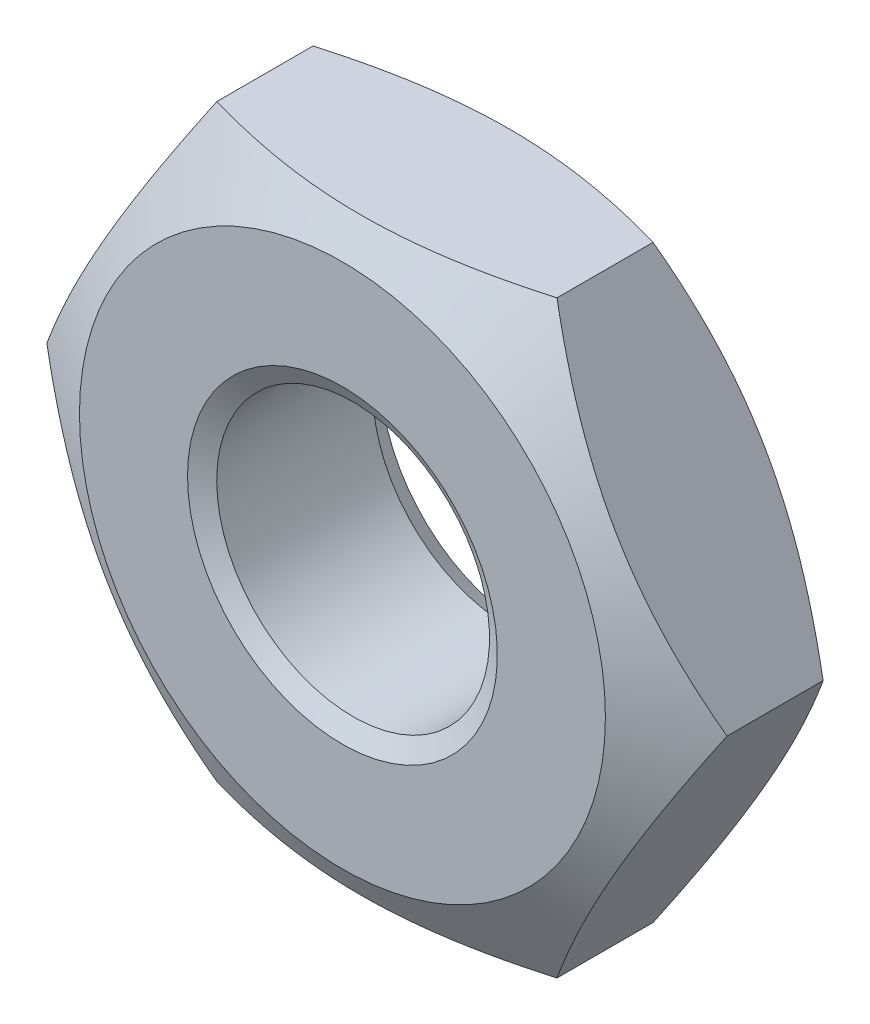
ISO-10303-21;
HEADER;
FILE_DESCRIPTION(('STEP AP214'),'2;1');
FILE_NAME('part.step','',(''),(''),'','','');
FILE_SCHEMA(('AUTOMOTIVE_DESIGN { 1 0 10303 214 1 1 1 1 }'));
ENDSEC;
DATA;
#1=APPLICATION_CONTEXT('core data for automotive mechanical design processes');
#2=APPLICATION_PROTOCOL_DEFINITION('international standard','automotive_design',2000,#1);
#3=PRODUCT_CONTEXT('',#1,'mechanical');
#4=PRODUCT('Part','Part','',(#3));
#5=PRODUCT_RELATED_PRODUCT_CATEGORY('part','',(#4));
#6=PRODUCT_DEFINITION_FORMATION('','',#4);
#7=PRODUCT_DEFINITION_CONTEXT('part definition',#1,'design');
#8=PRODUCT_DEFINITION('design','',#6,#7);
#9=PRODUCT_DEFINITION_SHAPE('','',#8);
#10=(LENGTH_UNIT() NAMED_UNIT(*) SI_UNIT(.MILLI.,.METRE.));
#11=(NAMED_UNIT(*) PLANE_ANGLE_UNIT() SI_UNIT($,.RADIAN.));
#12=(NAMED_UNIT(*) SI_UNIT($,.STERADIAN.) SOLID_ANGLE_UNIT());
#13=UNCERTAINTY_MEASURE_WITH_UNIT(LENGTH_MEASURE(1.E-05),#10,'distance_accuracy_value','');
#14=(GEOMETRIC_REPRESENTATION_CONTEXT(3) GLOBAL_UNCERTAINTY_ASSIGNED_CONTEXT((#13)) GLOBAL_UNIT_ASSIGNED_CONTEXT((#10,
#11,#12)) REPRESENTATION_CONTEXT('',''));
#15=CARTESIAN_POINT('',(0.,0.,0.));
#16=DIRECTION('',(0.,0.,1.));
#17=DIRECTION('',(1.,0.,0.));
#18=AXIS2_PLACEMENT_3D('',#15,#16,#17);
#19=CARTESIAN_POINT('',(-2.02072594216369,-3.5,-2.2));
#20=DIRECTION('',(0.,-1.,0.));
#21=DIRECTION('',(1.,0.,0.));
#22=AXIS2_PLACEMENT_3D('',#19,#20,#21);
#23=PLANE('',#22);
#24=CARTESIAN_POINT('',(-5.32929161655628,-3.5,-1.8768739570955));
#25=CARTESIAN_POINT('',(-5.17721390420334,-3.5,-1.80350487566599));
#26=CARTESIAN_POINT('',(-5.02477626879487,-3.5,-1.73086848507037));
#27=CARTESIAN_POINT('',(-4.71898932742077,-3.5,-1.58747532668502));
#28=CARTESIAN_POINT('',(-4.56563987276602,-3.5,-1.51671887634777));
#29=CARTESIAN_POINT('',(-4.25699896894404,-3.5,-1.37712246688913));
#30=CARTESIAN_POINT('',(-4.10170141818151,-3.5,-1.30829594938202));
#31=CARTESIAN_POINT('',(-3.78983593685733,-3.5,-1.17359495846471));
#32=CARTESIAN_POINT('',(-3.63326806987865,-3.5,-1.10772033836705));
#33=CARTESIAN_POINT('',(-3.31397317951131,-3.5,-0.97781828443784));
#34=CARTESIAN_POINT('',(-3.1512005381073,-3.5,-0.913902341262367));
#35=CARTESIAN_POINT('',(-2.82371486392436,-3.5,-0.791151177582949));
#36=CARTESIAN_POINT('',(-2.65900161073986,-3.5,-0.73231654063633));
#37=CARTESIAN_POINT('',(-2.32771428220931,-3.5,-0.621345152713909));
#38=CARTESIAN_POINT('',(-2.16114510129307,-3.5,-0.569193942659972));
#39=CARTESIAN_POINT('',(-1.82562056549125,-3.5,-0.473327366021485));
#40=CARTESIAN_POINT('',(-1.65666601191669,-3.5,-0.429609235647394));
#41=CARTESIAN_POINT('',(-1.31718369019254,-3.5,-0.352994778610296));
#42=CARTESIAN_POINT('',(-1.14666839877724,-3.5,-0.320044212866426));
#43=CARTESIAN_POINT('',(-0.80362519311759,-3.5,-0.266896804968947));
#44=CARTESIAN_POINT('',(-0.631097439623656,-3.5,-0.246698951170157));
#45=CARTESIAN_POINT('',(-0.287101025715155,-3.5,-0.220933629161962));
#46=CARTESIAN_POINT('',(-0.11564620335658,-3.5,-0.215185920399811));
#47=CARTESIAN_POINT('',(0.22713962522439,-3.5,-0.218339385870684));
#48=CARTESIAN_POINT('',(0.398470626774733,-3.5,-0.227241086660207));
#49=CARTESIAN_POINT('',(0.692349454676599,-3.5,-0.254460230237843));
#50=CARTESIAN_POINT('',(0.815219779631847,-3.5,-0.269472731532173));
#51=CARTESIAN_POINT('',(1.05998960024822,-3.5,-0.306041966481692));
#52=CARTESIAN_POINT('',(1.181888948341,-3.5,-0.327599676107724));
#53=CARTESIAN_POINT('',(1.54600794184171,-3.5,-0.400949728850131));
#54=CARTESIAN_POINT('',(1.7864984294178,-3.5,-0.461403324212361));
#55=CARTESIAN_POINT('',(2.14599672794727,-3.5,-0.565325828459473));
#56=CARTESIAN_POINT('',(2.26688905462246,-3.5,-0.602639268073536));
#57=CARTESIAN_POINT('',(2.50749825221244,-3.5,-0.680914127692014));
#58=CARTESIAN_POINT('',(2.62721511557209,-3.5,-0.72187557112648));
#59=CARTESIAN_POINT('',(2.86551603326949,-3.5,-0.806808159348505));
#60=CARTESIAN_POINT('',(2.98410049565285,-3.5,-0.850778169512184));
#61=CARTESIAN_POINT('',(3.22030222158572,-3.5,-0.941233650124732));
#62=CARTESIAN_POINT('',(3.33791949412912,-3.5,-0.987719097152016));
#63=CARTESIAN_POINT('',(3.60516917077565,-3.5,-1.09611499692003));
#64=CARTESIAN_POINT('',(3.75452937338733,-3.5,-1.15869521360889));
#65=CARTESIAN_POINT('',(4.05207329900666,-3.5,-1.28659848231524));
#66=CARTESIAN_POINT('',(4.20025696631961,-3.5,-1.3519216632692));
#67=CARTESIAN_POINT('',(4.64337511468221,-3.5,-1.55119395906001));
#68=CARTESIAN_POINT('',(4.93683132148516,-3.5,-1.68842699826923));
#69=CARTESIAN_POINT('',(5.52118834964412,-3.5,-1.96881056529861));
#70=CARTESIAN_POINT('',(5.81208673093573,-3.5,-2.11196612775869));
#71=CARTESIAN_POINT('',(6.39186182500917,-3.5,-2.40232740635005));
#72=CARTESIAN_POINT('',(6.6807384726872,-3.5,-2.54953325216251));
#73=CARTESIAN_POINT('',(7.23458971233423,-3.5,-2.83528891127491));
#74=CARTESIAN_POINT('',(7.49967651841012,-3.5,-2.97362193480413));
#75=CARTESIAN_POINT('',(8.02887233479629,-3.5,-3.25216194114885));
#76=CARTESIAN_POINT('',(8.29298131706612,-3.5,-3.39236897718081));
#77=CARTESIAN_POINT('',(8.81986478761872,-3.5,-3.67392059383066));
#78=CARTESIAN_POINT('',(9.082640922202,-3.5,-3.81526209803769));
#79=CARTESIAN_POINT('',(9.60756200305391,-3.5,-4.09908318288939));
#80=CARTESIAN_POINT('',(9.86970697870069,-3.5,-4.24156270917629));
#81=CARTESIAN_POINT('',(10.1316166656573,-3.5,-4.38447053028153));
#82=B_SPLINE_CURVE_WITH_KNOTS('',3,(#24,#25,#26,#27,#28,#29,#30,#31,#32,#33,#34,#35,#36,#37,#38,
#39,#40,#41,#42,#43,#44,#45,#46,#47,#48,#49,#50,#51,#52,#53,#54,#55,#56,#57,#58,#59,#60,#61,#62,
#63,#64,#65,#66,#67,#68,#69,#70,#71,#72,#73,#74,#75,#76,#77,#78,#79,#80,#81),.UNSPECIFIED.,.F.,
.F.,(4,2,2,2,2,2,2,2,2,2,2,2,2,2,2,2,2,2,2,2,2,2,2,2,2,2,2,2,4),(0.,0.506559628514696,
1.0132042594806,1.52277737705624,2.03232514447318,2.55687533860672,3.08148569427768,
3.60494121555669,4.12822489118331,4.64883048979078,5.16939478468658,5.68343298490769,
6.19748966205548,6.56865983363451,6.93988537844331,7.6827872097227,8.06231738596215,
8.44184999998748,8.82124026111236,9.20062699028891,9.68641258911835,10.1722210485271,
11.1439854050423,12.1165935361164,13.0892328442916,13.986254382644,14.8833014481238,
15.7784288466623,16.6735137420071),.UNSPECIFIED.);
#83=CARTESIAN_POINT('',(-2.02072594216369,-3.5,-0.529113742115746));
#84=VERTEX_POINT('',#83);
#85=CARTESIAN_POINT('',(2.02072594216369,-3.5,-0.529113742115746));
#86=VERTEX_POINT('',#85);
#87=EDGE_CURVE('E50',#84,#86,#82,.T.);
#88=ORIENTED_EDGE('',*,*,#87,.F.);
#89=DIRECTION('',(0.,0.,1.));
#90=VECTOR('',#89,1.);
#91=CARTESIAN_POINT('',(-2.02072594216369,-3.5,-2.2));
#92=LINE('',#91,#90);
#93=CARTESIAN_POINT('',(-2.02072594216369,-3.5,-1.67088625788425));
#94=VERTEX_POINT('',#93);
#95=EDGE_CURVE('E105',#94,#84,#92,.T.);
#96=ORIENTED_EDGE('',*,*,#95,.F.);
#97=CARTESIAN_POINT('',(-5.32929161655628,-3.5,-0.323126042904505));
#98=CARTESIAN_POINT('',(-5.17721390420334,-3.5,-0.396495124334007));
#99=CARTESIAN_POINT('',(-5.02477626879487,-3.5,-0.469131514929632));
#100=CARTESIAN_POINT('',(-4.71898932742077,-3.5,-0.612524673314984));
#101=CARTESIAN_POINT('',(-4.56563987276602,-3.5,-0.683281123652232));
#102=CARTESIAN_POINT('',(-4.25699896894404,-3.5,-0.822877533110865));
#103=CARTESIAN_POINT('',(-4.10170141818151,-3.5,-0.891704050617983));
#104=CARTESIAN_POINT('',(-3.78983593685733,-3.5,-1.02640504153529));
#105=CARTESIAN_POINT('',(-3.63326806987865,-3.5,-1.09227966163295));
#106=CARTESIAN_POINT('',(-3.31397317951131,-3.5,-1.22218171556216));
#107=CARTESIAN_POINT('',(-3.1512005381073,-3.5,-1.28609765873763));
#108=CARTESIAN_POINT('',(-2.82371486392436,-3.5,-1.40884882241705));
#109=CARTESIAN_POINT('',(-2.65900161073986,-3.5,-1.46768345936367));
#110=CARTESIAN_POINT('',(-2.32771428220931,-3.5,-1.57865484728609));
#111=CARTESIAN_POINT('',(-2.16114510129307,-3.5,-1.63080605734003));
#112=CARTESIAN_POINT('',(-1.82562056549125,-3.5,-1.72667263397852));
#113=CARTESIAN_POINT('',(-1.65666601191669,-3.5,-1.77039076435261));
#114=CARTESIAN_POINT('',(-1.31718369019254,-3.5,-1.8470052213897));
#115=CARTESIAN_POINT('',(-1.14666839877724,-3.5,-1.87995578713357));
#116=CARTESIAN_POINT('',(-0.803625193117589,-3.5,-1.93310319503105));
#117=CARTESIAN_POINT('',(-0.631097439623655,-3.5,-1.95330104882984));
#118=CARTESIAN_POINT('',(-0.287101025715154,-3.5,-1.97906637083804));
#119=CARTESIAN_POINT('',(-0.115646203356579,-3.5,-1.98481407960019));
#120=CARTESIAN_POINT('',(0.227139625224391,-3.5,-1.98166061412932));
#121=CARTESIAN_POINT('',(0.398470626774733,-3.5,-1.97275891333979));
#122=CARTESIAN_POINT('',(0.692349454676599,-3.5,-1.94553976976216));
#123=CARTESIAN_POINT('',(0.815219779631848,-3.5,-1.93052726846783));
#124=CARTESIAN_POINT('',(1.05998960024822,-3.5,-1.89395803351831));
#125=CARTESIAN_POINT('',(1.181888948341,-3.5,-1.87240032389228));
#126=CARTESIAN_POINT('',(1.54600794184171,-3.5,-1.79905027114987));
#127=CARTESIAN_POINT('',(1.78649842941779,-3.5,-1.73859667578764));
#128=CARTESIAN_POINT('',(2.14599672794727,-3.5,-1.63467417154053));
#129=CARTESIAN_POINT('',(2.26688905462246,-3.5,-1.59736073192646));
#130=CARTESIAN_POINT('',(2.50749825221244,-3.5,-1.51908587230799));
#131=CARTESIAN_POINT('',(2.62721511557209,-3.5,-1.47812442887352));
#132=CARTESIAN_POINT('',(2.86551603326949,-3.5,-1.3931918406515));
#133=CARTESIAN_POINT('',(2.98410049565285,-3.5,-1.34922183048782));
#134=CARTESIAN_POINT('',(3.22030222158572,-3.5,-1.25876634987527));
#135=CARTESIAN_POINT('',(3.33791949412912,-3.5,-1.21228090284798));
#136=CARTESIAN_POINT('',(3.60516917077565,-3.5,-1.10388500307997));
#137=CARTESIAN_POINT('',(3.75452937338733,-3.5,-1.04130478639111));
#138=CARTESIAN_POINT('',(4.05207329900666,-3.5,-0.913401517684764));
#139=CARTESIAN_POINT('',(4.20025696631961,-3.5,-0.848078336730803));
#140=CARTESIAN_POINT('',(4.64337511468222,-3.5,-0.648806040939994));
#141=CARTESIAN_POINT('',(4.93683132148516,-3.5,-0.511573001730766));
#142=CARTESIAN_POINT('',(5.52118834964412,-3.5,-0.231189434701391));
#143=CARTESIAN_POINT('',(5.81208673093573,-3.5,-0.0880338722413092));
#144=CARTESIAN_POINT('',(6.39186182500917,-3.5,0.202327406350047));
#145=CARTESIAN_POINT('',(6.6807384726872,-3.5,0.349533252162515));
#146=CARTESIAN_POINT('',(7.23458971233423,-3.5,0.635288911274913));
#147=CARTESIAN_POINT('',(7.49967651841012,-3.5,0.773621934804128));
#148=CARTESIAN_POINT('',(8.02887233479628,-3.5,1.05216194114885));
#149=CARTESIAN_POINT('',(8.29298131706611,-3.5,1.19236897718081));
#150=CARTESIAN_POINT('',(8.81986478761872,-3.5,1.47392059383066));
#151=CARTESIAN_POINT('',(9.082640922202,-3.5,1.61526209803769));
#152=CARTESIAN_POINT('',(9.60756200305391,-3.5,1.89908318288939));
#153=CARTESIAN_POINT('',(9.86970697870069,-3.5,2.0415627091763));
#154=CARTESIAN_POINT('',(10.1316166656573,-3.5,2.18447053028153));
#155=B_SPLINE_CURVE_WITH_KNOTS('',3,(#97,#98,#99,#100,#101,#102,#103,#104,#105,#106,#107,#108,
#109,#110,#111,#112,#113,#114,#115,#116,#117,#118,#119,#120,#121,#122,#123,#124,#125,#126,#127,
#128,#129,#130,#131,#132,#133,#134,#135,#136,#137,#138,#139,#140,#141,#142,#143,#144,#145,#146,
#147,#148,#149,#150,#151,#152,#153,#154),.UNSPECIFIED.,.F.,.F.,(4,2,2,2,2,2,2,2,2,2,2,2,2,2,2,2,
2,2,2,2,2,2,2,2,2,2,2,2,4),(0.,0.506559628514695,1.0132042594806,1.52277737705624,
2.03232514447318,2.55687533860672,3.08148569427768,3.60494121555669,4.12822489118331,
4.64883048979078,5.16939478468658,5.68343298490769,6.19748966205548,6.56865983363451,
6.93988537844331,7.6827872097227,8.06231738596215,8.44184999998748,8.82124026111235,
9.20062699028891,9.68641258911835,10.1722210485271,11.1439854050423,12.1165935361164,
13.0892328442916,13.986254382644,14.8833014481237,15.7784288466623,16.6735137420071),.UNSPECIFIED.);
#156=CARTESIAN_POINT('',(2.02072594216369,-3.5,-1.67088625788425));
#157=VERTEX_POINT('',#156);
#158=EDGE_CURVE('E126',#157,#94,#155,.F.);
#159=ORIENTED_EDGE('',*,*,#158,.F.);
#160=DIRECTION('',(0.,0.,1.));
#161=VECTOR('',#160,1.);
#162=CARTESIAN_POINT('',(2.02072594216369,-3.5,-2.2));
#163=LINE('',#162,#161);
#164=EDGE_CURVE('E123',#157,#86,#163,.T.);
#165=ORIENTED_EDGE('',*,*,#164,.T.);
#166=EDGE_LOOP('',(#88,#96,#159,#165));
#167=FACE_BOUND('',#166,.T.);
#168=ADVANCED_FACE('F35',(#167),#23,.T.);
#169=CARTESIAN_POINT('',(-4.04145188432738,0.,-2.2));
#170=DIRECTION('',(-0.866025403784439,-0.5,0.));
#171=DIRECTION('',(0.5,-0.866025403784439,0.));
#172=AXIS2_PLACEMENT_3D('',#169,#170,#171);
#173=PLANE('',#172);
#174=CARTESIAN_POINT('',(-4.04156735438122,0.000200000000000463,-0.529180411639473));
#175=CARTESIAN_POINT('',(-3.9527667384984,-0.153607178452449,-0.477892139936086));
#176=CARTESIAN_POINT('',(-3.86319960126198,-0.308742010834423,-0.431247304762301));
#177=CARTESIAN_POINT('',(-3.68251437287562,-0.62169800657678,-0.349828226479453));
#178=CARTESIAN_POINT('',(-3.59139307116725,-0.779524730787494,-0.315082786530667));
#179=CARTESIAN_POINT('',(-3.41027974688034,-1.09322221038013,-0.260996378128942));
#180=CARTESIAN_POINT('',(-3.32031559103708,-1.24904469916069,-0.241295437206487));
#181=CARTESIAN_POINT('',(-3.13996396008052,-1.56142288720537,-0.21777648368336));
#182=CARTESIAN_POINT('',(-3.04957714051106,-1.71797745103423,-0.213938995491671));
#183=CARTESIAN_POINT('',(-2.88068384499777,-2.01050921992099,-0.221921652823084));
#184=CARTESIAN_POINT('',(-2.80215208834114,-2.1465302124579,-0.231781785015713));
#185=CARTESIAN_POINT('',(-2.64560020969753,-2.41768602028899,-0.263032817845509));
#186=CARTESIAN_POINT('',(-2.5675806292065,-2.55281989768468,-0.284434394231903));
#187=CARTESIAN_POINT('',(-2.41070596159678,-2.82453479240518,-0.337936758826681));
#188=CARTESIAN_POINT('',(-2.33187072981463,-2.96108141927833,-0.370264345391191));
#189=CARTESIAN_POINT('',(-2.17537608630783,-3.2321380929445,-0.443635284754097));
#190=CARTESIAN_POINT('',(-2.09771466960098,-3.36665161246854,-0.484661397515969));
#191=CARTESIAN_POINT('',(-2.02061047210985,-3.5002,-0.529180411639473));
#192=B_SPLINE_CURVE_WITH_KNOTS('',3,(#174,#175,#176,#177,#178,#179,#180,#181,#182,#183,#184,
#185,#186,#187,#188,#189,#190,#191),.UNSPECIFIED.,.F.,.F.,(4,2,2,2,2,2,2,2,4),(0.,
0.554793832886253,1.11092123814983,1.65328467083218,2.19498204478403,2.6666513085086,
3.13875761298267,3.62133612600509,4.10296698719187),.UNSPECIFIED.);
#193=CARTESIAN_POINT('',(-4.04145188432738,0.,-0.529113742115746));
#194=VERTEX_POINT('',#193);
#195=EDGE_CURVE('E90',#194,#84,#192,.T.);
#196=ORIENTED_EDGE('',*,*,#195,.F.);
#197=DIRECTION('',(0.,0.,1.));
#198=VECTOR('',#197,1.);
#199=CARTESIAN_POINT('',(-4.04145188432738,0.,-2.2));
#200=LINE('',#199,#198);
#201=CARTESIAN_POINT('',(-4.04145188432738,0.,-1.67088625788425));
#202=VERTEX_POINT('',#201);
#203=EDGE_CURVE('E103',#202,#194,#200,.T.);
#204=ORIENTED_EDGE('',*,*,#203,.F.);
#205=CARTESIAN_POINT('',(-2.02061047210985,-3.5002,-1.67081958836053));
#206=CARTESIAN_POINT('',(-2.10941108799267,-3.34639282154755,-1.72210786006391));
#207=CARTESIAN_POINT('',(-2.19897822522909,-3.19125798916558,-1.7687526952377));
#208=CARTESIAN_POINT('',(-2.37966345361545,-2.87830199342322,-1.85017177352055));
#209=CARTESIAN_POINT('',(-2.47078475532382,-2.72047526921251,-1.88491721346933));
#210=CARTESIAN_POINT('',(-2.65189807961073,-2.40677778961987,-1.93900362187106));
#211=CARTESIAN_POINT('',(-2.74186223545399,-2.25095530083931,-1.95870456279351));
#212=CARTESIAN_POINT('',(-2.92221386641055,-1.93857711279463,-1.98222351631664));
#213=CARTESIAN_POINT('',(-3.01260068598001,-1.78202254896577,-1.98606100450833));
#214=CARTESIAN_POINT('',(-3.1814939814933,-1.48949078007901,-1.97807834717692));
#215=CARTESIAN_POINT('',(-3.26002573814993,-1.3534697875421,-1.96821821498429));
#216=CARTESIAN_POINT('',(-3.41657761679354,-1.08231397971101,-1.93696718215449));
#217=CARTESIAN_POINT('',(-3.49459719728457,-0.947180102315319,-1.9155656057681));
#218=CARTESIAN_POINT('',(-3.65147186489429,-0.675465207594817,-1.86206324117332));
#219=CARTESIAN_POINT('',(-3.73030709667644,-0.538918580721665,-1.82973565460881));
#220=CARTESIAN_POINT('',(-3.88680174018324,-0.267861907055499,-1.7563647152459));
#221=CARTESIAN_POINT('',(-3.96446315689009,-0.133348387531463,-1.71533860248403));
#222=CARTESIAN_POINT('',(-4.04156735438122,0.000200000000000567,-1.67081958836053));
#223=B_SPLINE_CURVE_WITH_KNOTS('',3,(#205,#206,#207,#208,#209,#210,#211,#212,#213,#214,#215,
#216,#217,#218,#219,#220,#221,#222),.UNSPECIFIED.,.F.,.F.,(4,2,2,2,2,2,2,2,4),(0.,
0.554793832886252,1.11092123814983,1.65328467083218,2.19498204478403,2.6666513085086,
3.13875761298267,3.6213361260051,4.10296698719187),.UNSPECIFIED.);
#224=EDGE_CURVE('E199',#94,#202,#223,.T.);
#225=ORIENTED_EDGE('',*,*,#224,.F.);
#226=ORIENTED_EDGE('',*,*,#95,.T.);
#227=EDGE_LOOP('',(#196,#204,#225,#226));
#228=FACE_BOUND('',#227,.T.);
#229=ADVANCED_FACE('F101',(#228),#173,.T.);
#230=CARTESIAN_POINT('',(-2.02072594216369,3.5,-2.2));
#231=DIRECTION('',(-0.866025403784438,0.5,0.));
#232=DIRECTION('',(-0.5,-0.866025403784439,0.));
#233=AXIS2_PLACEMENT_3D('',#230,#231,#232);
#234=PLANE('',#233);
#235=CARTESIAN_POINT('',(-2.02061047210985,3.5002,-0.529180411639473));
#236=CARTESIAN_POINT('',(-2.10941108799267,3.34639282154755,-0.477892139936087));
#237=CARTESIAN_POINT('',(-2.19897822522909,3.19125798916558,-0.431247304762301));
#238=CARTESIAN_POINT('',(-2.37966345361545,2.87830199342322,-0.349828226479453));
#239=CARTESIAN_POINT('',(-2.47078475532382,2.72047526921251,-0.315082786530667));
#240=CARTESIAN_POINT('',(-2.65189807961073,2.40677778961987,-0.260996378128942));
#241=CARTESIAN_POINT('',(-2.74186223545399,2.25095530083931,-0.241295437206488));
#242=CARTESIAN_POINT('',(-2.92221386641055,1.93857711279463,-0.217776483683361));
#243=CARTESIAN_POINT('',(-3.01260068598001,1.78202254896577,-0.213938995491672));
#244=CARTESIAN_POINT('',(-3.1814939814933,1.48949078007901,-0.221921652823084));
#245=CARTESIAN_POINT('',(-3.26002573814993,1.3534697875421,-0.231781785015713));
#246=CARTESIAN_POINT('',(-3.41657761679354,1.08231397971101,-0.263032817845509));
#247=CARTESIAN_POINT('',(-3.49459719728457,0.947180102315319,-0.284434394231903));
#248=CARTESIAN_POINT('',(-3.65147186489429,0.675465207594818,-0.337936758826682));
#249=CARTESIAN_POINT('',(-3.73030709667644,0.538918580721666,-0.370264345391191));
#250=CARTESIAN_POINT('',(-3.88680174018324,0.267861907055499,-0.443635284754098));
#251=CARTESIAN_POINT('',(-3.96446315689009,0.133348387531464,-0.48466139751597));
#252=CARTESIAN_POINT('',(-4.04156735438122,-0.0001999999999996,-0.529180411639473));
#253=B_SPLINE_CURVE_WITH_KNOTS('',3,(#235,#236,#237,#238,#239,#240,#241,#242,#243,#244,#245,
#246,#247,#248,#249,#250,#251,#252),.UNSPECIFIED.,.F.,.F.,(4,2,2,2,2,2,2,2,4),(0.,
0.554793832886252,1.11092123814983,1.65328467083218,2.19498204478403,2.6666513085086,
3.13875761298267,3.62133612600509,4.10296698719187),.UNSPECIFIED.);
#254=CARTESIAN_POINT('',(-2.02072594216369,3.5,-0.529113742115746));
#255=VERTEX_POINT('',#254);
#256=EDGE_CURVE('E86',#255,#194,#253,.T.);
#257=ORIENTED_EDGE('',*,*,#256,.F.);
#258=DIRECTION('',(0.,0.,1.));
#259=VECTOR('',#258,1.);
#260=CARTESIAN_POINT('',(-2.02072594216369,3.5,-2.2));
#261=LINE('',#260,#259);
#262=CARTESIAN_POINT('',(-2.02072594216369,3.5,-1.67088625788425));
#263=VERTEX_POINT('',#262);
#264=EDGE_CURVE('E110',#263,#255,#261,.T.);
#265=ORIENTED_EDGE('',*,*,#264,.F.);
#266=CARTESIAN_POINT('',(-4.04156735438122,-0.00019999999999959,-1.67081958836053));
#267=CARTESIAN_POINT('',(-3.9527667384984,0.15360717845245,-1.72210786006391));
#268=CARTESIAN_POINT('',(-3.86319960126198,0.308742010834424,-1.7687526952377));
#269=CARTESIAN_POINT('',(-3.68251437287562,0.621698006576781,-1.85017177352055));
#270=CARTESIAN_POINT('',(-3.59139307116725,0.779524730787495,-1.88491721346933));
#271=CARTESIAN_POINT('',(-3.41027974688034,1.09322221038013,-1.93900362187106));
#272=CARTESIAN_POINT('',(-3.32031559103708,1.24904469916069,-1.95870456279351));
#273=CARTESIAN_POINT('',(-3.13996396008052,1.56142288720537,-1.98222351631664));
#274=CARTESIAN_POINT('',(-3.04957714051106,1.71797745103423,-1.98606100450833));
#275=CARTESIAN_POINT('',(-2.88068384499777,2.01050921992099,-1.97807834717692));
#276=CARTESIAN_POINT('',(-2.80215208834115,2.1465302124579,-1.96821821498429));
#277=CARTESIAN_POINT('',(-2.64560020969754,2.41768602028899,-1.93696718215449));
#278=CARTESIAN_POINT('',(-2.5675806292065,2.55281989768468,-1.9155656057681));
#279=CARTESIAN_POINT('',(-2.41070596159678,2.82453479240518,-1.86206324117332));
#280=CARTESIAN_POINT('',(-2.33187072981463,2.96108141927834,-1.82973565460881));
#281=CARTESIAN_POINT('',(-2.17537608630783,3.2321380929445,-1.7563647152459));
#282=CARTESIAN_POINT('',(-2.09771466960098,3.36665161246854,-1.71533860248403));
#283=CARTESIAN_POINT('',(-2.02061047210985,3.5002,-1.67081958836053));
#284=B_SPLINE_CURVE_WITH_KNOTS('',3,(#266,#267,#268,#269,#270,#271,#272,#273,#274,#275,#276,
#277,#278,#279,#280,#281,#282,#283),.UNSPECIFIED.,.F.,.F.,(4,2,2,2,2,2,2,2,4),(0.,
0.554793832886253,1.11092123814983,1.65328467083218,2.19498204478403,2.6666513085086,
3.13875761298267,3.62133612600509,4.10296698719187),.UNSPECIFIED.);
#285=EDGE_CURVE('E109',#202,#263,#284,.T.);
#286=ORIENTED_EDGE('',*,*,#285,.F.);
#287=ORIENTED_EDGE('',*,*,#203,.T.);
#288=EDGE_LOOP('',(#257,#265,#286,#287));
#289=FACE_BOUND('',#288,.T.);
#290=ADVANCED_FACE('F108',(#289),#234,.T.);
#291=CARTESIAN_POINT('',(2.02072594216369,3.5,-2.2));
#292=DIRECTION('',(0.,1.,0.));
#293=DIRECTION('',(0.,0.,1.));
#294=AXIS2_PLACEMENT_3D('',#291,#292,#293);
#295=PLANE('',#294);
#296=CARTESIAN_POINT('',(-5.32929161654317,3.5,-1.87687395708917));
#297=CARTESIAN_POINT('',(-5.17721390419067,3.5,-1.80350487565993));
#298=CARTESIAN_POINT('',(-5.02477626878264,3.5,-1.73086848506458));
#299=CARTESIAN_POINT('',(-4.71898932740942,3.5,-1.58747532667975));
#300=CARTESIAN_POINT('',(-4.56563987275511,3.5,-1.51671887634277));
#301=CARTESIAN_POINT('',(-4.25699896893402,3.5,-1.37712246688467));
#302=CARTESIAN_POINT('',(-4.10170141817195,3.5,-1.30829594937782));
#303=CARTESIAN_POINT('',(-3.78983593684866,3.5,-1.17359495846103));
#304=CARTESIAN_POINT('',(-3.63326806987044,3.5,-1.10772033836364));
#305=CARTESIAN_POINT('',(-3.31397317950403,3.5,-0.977818284434953));
#306=CARTESIAN_POINT('',(-3.1512005381005,3.5,-0.913902341259744));
#307=CARTESIAN_POINT('',(-2.82371486391853,3.5,-0.79115117758084));
#308=CARTESIAN_POINT('',(-2.65900161073452,3.5,-0.732316540634471));
#309=CARTESIAN_POINT('',(-2.32771428220496,3.5,-0.621345152712524));
#310=CARTESIAN_POINT('',(-2.16114510128922,3.5,-0.569193942658811));
#311=CARTESIAN_POINT('',(-1.82562056548841,3.5,-0.473327366020735));
#312=CARTESIAN_POINT('',(-1.65666601191436,3.5,-0.429609235646829));
#313=CARTESIAN_POINT('',(-1.31718369019152,3.5,-0.352994778610104));
#314=CARTESIAN_POINT('',(-1.14666839877701,3.5,-0.320044212866405));
#315=CARTESIAN_POINT('',(-0.803625193118965,3.5,-0.266896804969146));
#316=CARTESIAN_POINT('',(-0.631097439625842,3.5,-0.246698951170405));
#317=CARTESIAN_POINT('',(-0.287101025718949,3.5,-0.220933629162164));
#318=CARTESIAN_POINT('',(-0.115646203361171,3.5,-0.215185920399921));
#319=CARTESIAN_POINT('',(0.227139625218219,3.5,-0.218339385870476));
#320=CARTESIAN_POINT('',(0.398470626767779,3.5,-0.227241086659771));
#321=CARTESIAN_POINT('',(0.692349454668638,3.5,-0.254460230236955));
#322=CARTESIAN_POINT('',(0.815219779623655,3.5,-0.269472731531103));
#323=CARTESIAN_POINT('',(1.05998960023958,3.5,-0.306041966480247));
#324=CARTESIAN_POINT('',(1.18188894833212,3.5,-0.327599676106087));
#325=CARTESIAN_POINT('',(1.54600794183219,3.5,-0.400949728847912));
#326=CARTESIAN_POINT('',(1.78649842940784,3.5,-0.461403324209749));
#327=CARTESIAN_POINT('',(2.14599672793669,3.5,-0.565325828456279));
#328=CARTESIAN_POINT('',(2.26688905461166,3.5,-0.602639268070147));
#329=CARTESIAN_POINT('',(2.50749825220121,3.5,-0.68091412768824));
#330=CARTESIAN_POINT('',(2.62721511556065,3.5,-0.721875571122515));
#331=CARTESIAN_POINT('',(2.86551603325762,3.5,-0.806808159344167));
#332=CARTESIAN_POINT('',(2.98410049564078,3.5,-0.850778169507661));
#333=CARTESIAN_POINT('',(3.22030222157322,3.5,-0.941233650119847));
#334=CARTESIAN_POINT('',(3.33791949411641,3.5,-0.987719097146953));
#335=CARTESIAN_POINT('',(3.60516917076279,3.5,-1.0961149969147));
#336=CARTESIAN_POINT('',(3.75452937337452,3.5,-1.15869521360348));
#337=CARTESIAN_POINT('',(4.05207329899395,3.5,-1.28659848230968));
#338=CARTESIAN_POINT('',(4.20025696630695,3.5,-1.35192166326358));
#339=CARTESIAN_POINT('',(4.64337511466969,3.5,-1.55119395905422));
#340=CARTESIAN_POINT('',(4.93683132147272,3.5,-1.68842699826337));
#341=CARTESIAN_POINT('',(5.52118834963183,3.5,-1.96881056529261));
#342=CARTESIAN_POINT('',(5.81208673092351,3.5,-2.11196612775264));
#343=CARTESIAN_POINT('',(6.39186182499708,3.5,-2.40232740634392));
#344=CARTESIAN_POINT('',(6.68073847267517,3.5,-2.54953325215636));
#345=CARTESIAN_POINT('',(7.23458971232227,3.5,-2.83528891126869));
#346=CARTESIAN_POINT('',(7.49967651839816,3.5,-2.97362193479787));
#347=CARTESIAN_POINT('',(8.02887233478434,3.5,-3.25216194114253));
#348=CARTESIAN_POINT('',(8.29298131705418,3.5,-3.39236897717446));
#349=CARTESIAN_POINT('',(8.81986478760678,3.5,-3.67392059382426));
#350=CARTESIAN_POINT('',(9.08264092219006,3.5,-3.81526209803125));
#351=CARTESIAN_POINT('',(9.60756200304195,3.5,-4.0990831828829));
#352=CARTESIAN_POINT('',(9.86970697868873,3.5,-4.24156270916979));
#353=CARTESIAN_POINT('',(10.1316166656453,3.5,-4.38447053027499));
#354=B_SPLINE_CURVE_WITH_KNOTS('',3,(#296,#297,#298,#299,#300,#301,#302,#303,#304,#305,#306,
#307,#308,#309,#310,#311,#312,#313,#314,#315,#316,#317,#318,#319,#320,#321,#322,#323,#324,#325,
#326,#327,#328,#329,#330,#331,#332,#333,#334,#335,#336,#337,#338,#339,#340,#341,#342,#343,#344,
#345,#346,#347,#348,#349,#350,#351,#352,#353),.UNSPECIFIED.,.F.,.F.,(4,2,2,2,2,2,2,2,2,2,2,2,2,
2,2,2,2,2,2,2,2,2,2,2,2,2,2,2,4),(0.,0.50655962851316,1.01320425947753,1.52277737705162,
2.032325144467,2.55687533859891,3.08148569426823,3.60494121554561,4.1282248911706,
4.64883048977565,5.16939478466902,5.68343298488776,6.19748966203317,6.56865983361144,
6.93988537841949,7.68278720969736,8.06231738593602,8.44184999996057,8.82124026108465,
9.20062699026042,9.68641258908992,10.1722210484987,11.143985405014,12.1165935360882,
13.0892328442636,13.986254382616,14.8833014480957,15.7784288466341,16.673513741979),.UNSPECIFIED.);
#355=CARTESIAN_POINT('',(2.02072594216369,3.5,-0.529113742115746));
#356=VERTEX_POINT('',#355);
#357=EDGE_CURVE('E92',#356,#255,#354,.F.);
#358=ORIENTED_EDGE('',*,*,#357,.F.);
#359=DIRECTION('',(0.,0.,1.));
#360=VECTOR('',#359,1.);
#361=CARTESIAN_POINT('',(2.02072594216369,3.5,-2.2));
#362=LINE('',#361,#360);
#363=CARTESIAN_POINT('',(2.02072594216369,3.5,-1.67088625788425));
#364=VERTEX_POINT('',#363);
#365=EDGE_CURVE('E114',#364,#356,#362,.T.);
#366=ORIENTED_EDGE('',*,*,#365,.F.);
#367=CARTESIAN_POINT('',(-5.32929161654317,3.5,-0.323126042910831));
#368=CARTESIAN_POINT('',(-5.17721390419067,3.5,-0.396495124340066));
#369=CARTESIAN_POINT('',(-5.02477626878264,3.5,-0.469131514935425));
#370=CARTESIAN_POINT('',(-4.71898932740942,3.5,-0.612524673320245));
#371=CARTESIAN_POINT('',(-4.56563987275511,3.5,-0.683281123657229));
#372=CARTESIAN_POINT('',(-4.25699896893402,3.5,-0.822877533115331));
#373=CARTESIAN_POINT('',(-4.10170141817195,3.5,-0.891704050622184));
#374=CARTESIAN_POINT('',(-3.78983593684867,3.5,-1.02640504153897));
#375=CARTESIAN_POINT('',(-3.63326806987044,3.5,-1.09227966163636));
#376=CARTESIAN_POINT('',(-3.31397317950403,3.5,-1.22218171556505));
#377=CARTESIAN_POINT('',(-3.1512005381005,3.5,-1.28609765874026));
#378=CARTESIAN_POINT('',(-2.82371486391854,3.5,-1.40884882241916));
#379=CARTESIAN_POINT('',(-2.65900161073452,3.5,-1.46768345936553));
#380=CARTESIAN_POINT('',(-2.32771428220496,3.5,-1.57865484728748));
#381=CARTESIAN_POINT('',(-2.16114510128922,3.5,-1.63080605734119));
#382=CARTESIAN_POINT('',(-1.82562056548841,3.5,-1.72667263397927));
#383=CARTESIAN_POINT('',(-1.65666601191436,3.5,-1.77039076435317));
#384=CARTESIAN_POINT('',(-1.31718369019152,3.5,-1.8470052213899));
#385=CARTESIAN_POINT('',(-1.14666839877701,3.5,-1.8799557871336));
#386=CARTESIAN_POINT('',(-0.803625193118965,3.5,-1.93310319503085));
#387=CARTESIAN_POINT('',(-0.631097439625842,3.5,-1.9533010488296));
#388=CARTESIAN_POINT('',(-0.287101025718949,3.5,-1.97906637083784));
#389=CARTESIAN_POINT('',(-0.115646203361171,3.5,-1.98481407960008));
#390=CARTESIAN_POINT('',(0.227139625218219,3.5,-1.98166061412952));
#391=CARTESIAN_POINT('',(0.398470626767779,3.5,-1.97275891334023));
#392=CARTESIAN_POINT('',(0.692349454668638,3.5,-1.94553976976305));
#393=CARTESIAN_POINT('',(0.815219779623654,3.5,-1.9305272684689));
#394=CARTESIAN_POINT('',(1.05998960023957,3.5,-1.89395803351975));
#395=CARTESIAN_POINT('',(1.18188894833212,3.5,-1.87240032389391));
#396=CARTESIAN_POINT('',(1.54600794183219,3.5,-1.79905027115209));
#397=CARTESIAN_POINT('',(1.78649842940784,3.5,-1.73859667579025));
#398=CARTESIAN_POINT('',(2.14599672793669,3.5,-1.63467417154372));
#399=CARTESIAN_POINT('',(2.26688905461166,3.5,-1.59736073192985));
#400=CARTESIAN_POINT('',(2.50749825220122,3.5,-1.51908587231176));
#401=CARTESIAN_POINT('',(2.62721511556065,3.5,-1.47812442887748));
#402=CARTESIAN_POINT('',(2.86551603325762,3.5,-1.39319184065583));
#403=CARTESIAN_POINT('',(2.98410049564078,3.5,-1.34922183049234));
#404=CARTESIAN_POINT('',(3.22030222157322,3.5,-1.25876634988015));
#405=CARTESIAN_POINT('',(3.33791949411641,3.5,-1.21228090285305));
#406=CARTESIAN_POINT('',(3.60516917076279,3.5,-1.1038850030853));
#407=CARTESIAN_POINT('',(3.75452937337452,3.5,-1.04130478639652));
#408=CARTESIAN_POINT('',(4.05207329899395,3.5,-0.913401517690318));
#409=CARTESIAN_POINT('',(4.20025696630695,3.5,-0.848078336736419));
#410=CARTESIAN_POINT('',(4.6433751146697,3.5,-0.648806040945776));
#411=CARTESIAN_POINT('',(4.93683132147272,3.5,-0.511573001736631));
#412=CARTESIAN_POINT('',(5.52118834963183,3.5,-0.231189434707389));
#413=CARTESIAN_POINT('',(5.81208673092352,3.5,-0.0880338722473561));
#414=CARTESIAN_POINT('',(6.39186182499709,3.5,0.202327406343923));
#415=CARTESIAN_POINT('',(6.68073847267517,3.5,0.349533252156362));
#416=CARTESIAN_POINT('',(7.23458971232227,3.5,0.635288911268695));
#417=CARTESIAN_POINT('',(7.49967651839817,3.5,0.773621934797872));
#418=CARTESIAN_POINT('',(8.02887233478434,3.5,1.05216194114253));
#419=CARTESIAN_POINT('',(8.29298131705418,3.5,1.19236897717446));
#420=CARTESIAN_POINT('',(8.81986478760678,3.5,1.47392059382426));
#421=CARTESIAN_POINT('',(9.08264092219006,3.5,1.61526209803125));
#422=CARTESIAN_POINT('',(9.60756200304195,3.5,1.8990831828829));
#423=CARTESIAN_POINT('',(9.86970697868873,3.5,2.04156270916978));
#424=CARTESIAN_POINT('',(10.1316166656453,3.5,2.18447053027499));
#425=B_SPLINE_CURVE_WITH_KNOTS('',3,(#367,#368,#369,#370,#371,#372,#373,#374,#375,#376,#377,
#378,#379,#380,#381,#382,#383,#384,#385,#386,#387,#388,#389,#390,#391,#392,#393,#394,#395,#396,
#397,#398,#399,#400,#401,#402,#403,#404,#405,#406,#407,#408,#409,#410,#411,#412,#413,#414,#415,
#416,#417,#418,#419,#420,#421,#422,#423,#424),.UNSPECIFIED.,.F.,.F.,(4,2,2,2,2,2,2,2,2,2,2,2,2,
2,2,2,2,2,2,2,2,2,2,2,2,2,2,2,4),(0.,0.50655962851316,1.01320425947753,1.52277737705162,
2.032325144467,2.55687533859891,3.08148569426823,3.60494121554561,4.12822489117061,
4.64883048977565,5.16939478466903,5.68343298488776,6.19748966203317,6.56865983361144,
6.93988537841949,7.68278720969736,8.06231738593603,8.44184999996057,8.82124026108465,
9.20062699026042,9.68641258908992,10.1722210484987,11.143985405014,12.1165935360882,
13.0892328442636,13.986254382616,14.8833014480957,15.7784288466341,16.673513741979),.UNSPECIFIED.);
#426=EDGE_CURVE('E186',#263,#364,#425,.T.);
#427=ORIENTED_EDGE('',*,*,#426,.F.);
#428=ORIENTED_EDGE('',*,*,#264,.T.);
#429=EDGE_LOOP('',(#358,#366,#427,#428));
#430=FACE_BOUND('',#429,.T.);
#431=ADVANCED_FACE('F234',(#430),#295,.T.);
#432=CARTESIAN_POINT('',(4.04145188432738,0.,-2.2));
#433=DIRECTION('',(0.866025403784438,0.5,0.));
#434=DIRECTION('',(-0.5,0.866025403784438,0.));
#435=AXIS2_PLACEMENT_3D('',#432,#433,#434);
#436=PLANE('',#435);
#437=CARTESIAN_POINT('',(4.04156735438122,-0.000199999999998702,-0.529180411639473));
#438=CARTESIAN_POINT('',(3.9527667384984,0.153607178452451,-0.477892139936087));
#439=CARTESIAN_POINT('',(3.86319960126198,0.308742010834425,-0.431247304762301));
#440=CARTESIAN_POINT('',(3.68251437287562,0.621698006576782,-0.349828226479453));
#441=CARTESIAN_POINT('',(3.59139307116725,0.779524730787496,-0.315082786530667));
#442=CARTESIAN_POINT('',(3.41027974688034,1.09322221038013,-0.260996378128942));
#443=CARTESIAN_POINT('',(3.32031559103708,1.24904469916069,-0.241295437206488));
#444=CARTESIAN_POINT('',(3.13996396008052,1.56142288720537,-0.217776483683361));
#445=CARTESIAN_POINT('',(3.04957714051106,1.71797745103423,-0.213938995491671));
#446=CARTESIAN_POINT('',(2.88068384499777,2.01050921992099,-0.221921652823084));
#447=CARTESIAN_POINT('',(2.80215208834114,2.14653021245791,-0.231781785015713));
#448=CARTESIAN_POINT('',(2.64560020969753,2.41768602028899,-0.263032817845509));
#449=CARTESIAN_POINT('',(2.5675806292065,2.55281989768468,-0.284434394231903));
#450=CARTESIAN_POINT('',(2.41070596159678,2.82453479240518,-0.337936758826681));
#451=CARTESIAN_POINT('',(2.33187072981463,2.96108141927834,-0.370264345391191));
#452=CARTESIAN_POINT('',(2.17537608630783,3.2321380929445,-0.443635284754097));
#453=CARTESIAN_POINT('',(2.09771466960098,3.36665161246854,-0.484661397515969));
#454=CARTESIAN_POINT('',(2.02061047210985,3.5002,-0.529180411639473));
#455=B_SPLINE_CURVE_WITH_KNOTS('',3,(#437,#438,#439,#440,#441,#442,#443,#444,#445,#446,#447,
#448,#449,#450,#451,#452,#453,#454),.UNSPECIFIED.,.F.,.F.,(4,2,2,2,2,2,2,2,4),(0.,
0.554793832886253,1.11092123814983,1.65328467083218,2.19498204478403,2.6666513085086,
3.13875761298267,3.62133612600509,4.10296698719187),.UNSPECIFIED.);
#456=CARTESIAN_POINT('',(4.04145188432738,0.,-0.529113742115746));
#457=VERTEX_POINT('',#456);
#458=EDGE_CURVE('E228',#457,#356,#455,.T.);
#459=ORIENTED_EDGE('',*,*,#458,.F.);
#460=DIRECTION('',(0.,0.,1.));
#461=VECTOR('',#460,1.);
#462=CARTESIAN_POINT('',(4.04145188432738,0.,-2.2));
#463=LINE('',#462,#461);
#464=CARTESIAN_POINT('',(4.04145188432738,0.,-1.67088625788425));
#465=VERTEX_POINT('',#464);
#466=EDGE_CURVE('E120',#465,#457,#463,.T.);
#467=ORIENTED_EDGE('',*,*,#466,.F.);
#468=CARTESIAN_POINT('',(2.02061047210985,3.5002,-1.67081958836053));
#469=CARTESIAN_POINT('',(2.10941108799267,3.34639282154755,-1.72210786006391));
#470=CARTESIAN_POINT('',(2.19897822522909,3.19125798916558,-1.7687526952377));
#471=CARTESIAN_POINT('',(2.37966345361545,2.87830199342322,-1.85017177352055));
#472=CARTESIAN_POINT('',(2.47078475532382,2.72047526921251,-1.88491721346933));
#473=CARTESIAN_POINT('',(2.65189807961073,2.40677778961987,-1.93900362187106));
#474=CARTESIAN_POINT('',(2.74186223545399,2.25095530083931,-1.95870456279351));
#475=CARTESIAN_POINT('',(2.92221386641055,1.93857711279463,-1.98222351631664));
#476=CARTESIAN_POINT('',(3.01260068598001,1.78202254896577,-1.98606100450833));
#477=CARTESIAN_POINT('',(3.1814939814933,1.48949078007901,-1.97807834717692));
#478=CARTESIAN_POINT('',(3.26002573814993,1.3534697875421,-1.96821821498429));
#479=CARTESIAN_POINT('',(3.41657761679354,1.08231397971101,-1.93696718215449));
#480=CARTESIAN_POINT('',(3.49459719728457,0.94718010231532,-1.9155656057681));
#481=CARTESIAN_POINT('',(3.65147186489429,0.675465207594819,-1.86206324117332));
#482=CARTESIAN_POINT('',(3.73030709667644,0.538918580721667,-1.82973565460881));
#483=CARTESIAN_POINT('',(3.88680174018324,0.2678619070555,-1.7563647152459));
#484=CARTESIAN_POINT('',(3.96446315689009,0.133348387531465,-1.71533860248403));
#485=CARTESIAN_POINT('',(4.04156735438122,-0.000199999999998928,-1.67081958836053));
#486=B_SPLINE_CURVE_WITH_KNOTS('',3,(#468,#469,#470,#471,#472,#473,#474,#475,#476,#477,#478,
#479,#480,#481,#482,#483,#484,#485),.UNSPECIFIED.,.F.,.F.,(4,2,2,2,2,2,2,2,4),(0.,
0.554793832886253,1.11092123814983,1.65328467083218,2.19498204478403,2.6666513085086,
3.13875761298267,3.62133612600509,4.10296698719187),.UNSPECIFIED.);
#487=EDGE_CURVE('E58',#364,#465,#486,.T.);
#488=ORIENTED_EDGE('',*,*,#487,.F.);
#489=ORIENTED_EDGE('',*,*,#365,.T.);
#490=EDGE_LOOP('',(#459,#467,#488,#489));
#491=FACE_BOUND('',#490,.T.);
#492=ADVANCED_FACE('F237',(#491),#436,.T.);
#493=CARTESIAN_POINT('',(2.02072594216369,-3.5,-2.2));
#494=DIRECTION('',(0.866025403784439,-0.5,0.));
#495=DIRECTION('',(0.5,0.866025403784439,0.));
#496=AXIS2_PLACEMENT_3D('',#493,#494,#495);
#497=PLANE('',#496);
#498=CARTESIAN_POINT('',(2.02061047210985,-3.5002,-0.529180411639472));
#499=CARTESIAN_POINT('',(2.10941108799267,-3.34639282154755,-0.477892139936085));
#500=CARTESIAN_POINT('',(2.19897822522909,-3.19125798916558,-0.4312473047623));
#501=CARTESIAN_POINT('',(2.37966345361545,-2.87830199342322,-0.349828226479453));
#502=CARTESIAN_POINT('',(2.47078475532382,-2.7204752692125,-0.315082786530666));
#503=CARTESIAN_POINT('',(2.65189807961073,-2.40677778961987,-0.260996378128941));
#504=CARTESIAN_POINT('',(2.74186223545399,-2.25095530083931,-0.241295437206487));
#505=CARTESIAN_POINT('',(2.92221386641055,-1.93857711279463,-0.21777648368336));
#506=CARTESIAN_POINT('',(3.01260068598001,-1.78202254896577,-0.213938995491671));
#507=CARTESIAN_POINT('',(3.1814939814933,-1.48949078007901,-0.221921652823083));
#508=CARTESIAN_POINT('',(3.26002573814993,-1.3534697875421,-0.231781785015713));
#509=CARTESIAN_POINT('',(3.41657761679354,-1.08231397971101,-0.263032817845509));
#510=CARTESIAN_POINT('',(3.49459719728457,-0.947180102315318,-0.284434394231903));
#511=CARTESIAN_POINT('',(3.65147186489429,-0.675465207594817,-0.337936758826681));
#512=CARTESIAN_POINT('',(3.73030709667644,-0.538918580721665,-0.370264345391191));
#513=CARTESIAN_POINT('',(3.88680174018324,-0.267861907055498,-0.443635284754097));
#514=CARTESIAN_POINT('',(3.96446315689009,-0.133348387531462,-0.48466139751597));
#515=CARTESIAN_POINT('',(4.04156735438122,0.000200000000001427,-0.529180411639473));
#516=B_SPLINE_CURVE_WITH_KNOTS('',3,(#498,#499,#500,#501,#502,#503,#504,#505,#506,#507,#508,
#509,#510,#511,#512,#513,#514,#515),.UNSPECIFIED.,.F.,.F.,(4,2,2,2,2,2,2,2,4),(0.,
0.554793832886252,1.11092123814983,1.65328467083218,2.19498204478403,2.6666513085086,
3.13875761298267,3.62133612600509,4.10296698719187),.UNSPECIFIED.);
#517=EDGE_CURVE('E258',#86,#457,#516,.T.);
#518=ORIENTED_EDGE('',*,*,#517,.F.);
#519=ORIENTED_EDGE('',*,*,#164,.F.);
#520=CARTESIAN_POINT('',(4.04156735438122,0.000200000000001351,-1.67081958836053));
#521=CARTESIAN_POINT('',(3.9527667384984,-0.153607178452448,-1.72210786006391));
#522=CARTESIAN_POINT('',(3.86319960126198,-0.308742010834422,-1.7687526952377));
#523=CARTESIAN_POINT('',(3.68251437287562,-0.621698006576779,-1.85017177352055));
#524=CARTESIAN_POINT('',(3.59139307116725,-0.779524730787494,-1.88491721346933));
#525=CARTESIAN_POINT('',(3.41027974688034,-1.09322221038012,-1.93900362187106));
#526=CARTESIAN_POINT('',(3.32031559103708,-1.24904469916069,-1.95870456279351));
#527=CARTESIAN_POINT('',(3.13996396008052,-1.56142288720537,-1.98222351631664));
#528=CARTESIAN_POINT('',(3.04957714051106,-1.71797745103423,-1.98606100450833));
#529=CARTESIAN_POINT('',(2.88068384499777,-2.01050921992099,-1.97807834717692));
#530=CARTESIAN_POINT('',(2.80215208834114,-2.1465302124579,-1.96821821498429));
#531=CARTESIAN_POINT('',(2.64560020969753,-2.41768602028899,-1.93696718215449));
#532=CARTESIAN_POINT('',(2.5675806292065,-2.55281989768468,-1.9155656057681));
#533=CARTESIAN_POINT('',(2.41070596159678,-2.82453479240518,-1.86206324117332));
#534=CARTESIAN_POINT('',(2.33187072981463,-2.96108141927833,-1.82973565460881));
#535=CARTESIAN_POINT('',(2.17537608630783,-3.2321380929445,-1.7563647152459));
#536=CARTESIAN_POINT('',(2.09771466960098,-3.36665161246854,-1.71533860248403));
#537=CARTESIAN_POINT('',(2.02061047210985,-3.5002,-1.67081958836053));
#538=B_SPLINE_CURVE_WITH_KNOTS('',3,(#520,#521,#522,#523,#524,#525,#526,#527,#528,#529,#530,
#531,#532,#533,#534,#535,#536,#537),.UNSPECIFIED.,.F.,.F.,(4,2,2,2,2,2,2,2,4),(0.,
0.554793832886253,1.11092123814983,1.65328467083218,2.19498204478403,2.6666513085086,
3.13875761298267,3.62133612600509,4.10296698719187),.UNSPECIFIED.);
#539=EDGE_CURVE('E152',#465,#157,#538,.T.);
#540=ORIENTED_EDGE('',*,*,#539,.F.);
#541=ORIENTED_EDGE('',*,*,#466,.T.);
#542=EDGE_LOOP('',(#518,#519,#540,#541));
#543=FACE_BOUND('',#542,.T.);
#544=ADVANCED_FACE('F146',(#543),#497,.T.);
#545=CARTESIAN_POINT('',(-2.02072594216369,-3.5,-2.2));
#546=DIRECTION('',(0.,0.,-1.));
#547=DIRECTION('',(-1.,0.,0.));
#548=AXIS2_PLACEMENT_3D('',#545,#546,#547);
#549=PLANE('',#548);
#550=CARTESIAN_POINT('',(0.,0.,-2.2));
#551=DIRECTION('',(0.,0.,-1.));
#552=DIRECTION('',(-1.,0.,0.));
#553=AXIS2_PLACEMENT_3D('',#550,#551,#552);
#554=CIRCLE('',#553,1.74801705922172);
#555=CARTESIAN_POINT('',(-1.74801705922172,0.,-2.2));
#556=VERTEX_POINT('',#555);
#557=EDGE_CURVE('E112',#556,#556,#554,.F.);
#558=ORIENTED_EDGE('',*,*,#557,.T.);
#559=EDGE_LOOP('',(#558));
#560=FACE_BOUND('',#559,.T.);
#561=CARTESIAN_POINT('',(0.,0.,-2.2));
#562=DIRECTION('',(0.,0.,-1.));
#563=DIRECTION('',(-1.,0.,0.));
#564=AXIS2_PLACEMENT_3D('',#561,#562,#563);
#565=CIRCLE('',#564,3.125);
#566=CARTESIAN_POINT('',(-3.125,0.,-2.2));
#567=VERTEX_POINT('',#566);
#568=EDGE_CURVE('E150',#567,#567,#565,.T.);
#569=ORIENTED_EDGE('',*,*,#568,.T.);
#570=EDGE_LOOP('',(#569));
#571=FACE_BOUND('',#570,.T.);
#572=ADVANCED_FACE('F142',(#560,#571),#549,.T.);
#573=CARTESIAN_POINT('',(-2.02072594216369,-3.5,0.));
#574=DIRECTION('',(0.,0.,-1.));
#575=DIRECTION('',(-1.,0.,0.));
#576=AXIS2_PLACEMENT_3D('',#573,#574,#575);
#577=PLANE('',#576);
#578=CARTESIAN_POINT('',(0.,0.,0.));
#579=DIRECTION('',(0.,0.,-1.));
#580=DIRECTION('',(-1.,0.,0.));
#581=AXIS2_PLACEMENT_3D('',#578,#579,#580);
#582=CIRCLE('',#581,1.841);
#583=CARTESIAN_POINT('',(-1.841,0.,0.));
#584=VERTEX_POINT('',#583);
#585=EDGE_CURVE('E11',#584,#584,#582,.T.);
#586=ORIENTED_EDGE('',*,*,#585,.T.);
#587=EDGE_LOOP('',(#586));
#588=FACE_BOUND('',#587,.T.);
#589=CARTESIAN_POINT('',(0.,0.,0.));
#590=DIRECTION('',(0.,0.,-1.));
#591=DIRECTION('',(-1.,0.,0.));
#592=AXIS2_PLACEMENT_3D('',#589,#590,#591);
#593=CIRCLE('',#592,3.125);
#594=CARTESIAN_POINT('',(-3.125,0.,0.));
#595=VERTEX_POINT('',#594);
#596=EDGE_CURVE('E259',#595,#595,#593,.T.);
#597=ORIENTED_EDGE('',*,*,#596,.F.);
#598=EDGE_LOOP('',(#597));
#599=FACE_BOUND('',#598,.T.);
#600=ADVANCED_FACE('F145',(#588,#599),#577,.F.);
#601=CARTESIAN_POINT('',(0.,0.,-2.2));
#602=DIRECTION('',(0.,0.,1.));
#603=DIRECTION('',(1.,0.,0.));
#604=AXIS2_PLACEMENT_3D('',#601,#602,#603);
#605=CYLINDRICAL_SURFACE('',#604,1.621);
#606=CARTESIAN_POINT('',(0.,0.,-1.98));
#607=DIRECTION('',(0.,0.,-1.));
#608=DIRECTION('',(-1.,0.,0.));
#609=AXIS2_PLACEMENT_3D('',#606,#607,#608);
#610=CIRCLE('',#609,1.621);
#611=CARTESIAN_POINT('',(-1.621,0.,-1.98));
#612=VERTEX_POINT('',#611);
#613=EDGE_CURVE('E43',#612,#612,#610,.T.);
#614=ORIENTED_EDGE('',*,*,#613,.T.);
#615=EDGE_LOOP('',(#614));
#616=FACE_BOUND('',#615,.T.);
#617=CARTESIAN_POINT('',(0.,0.,-0.127017059221719));
#618=DIRECTION('',(0.,0.,-1.));
#619=DIRECTION('',(-1.,0.,0.));
#620=AXIS2_PLACEMENT_3D('',#617,#618,#619);
#621=CIRCLE('',#620,1.621);
#622=CARTESIAN_POINT('',(-1.621,0.,-0.127017059221719));
#623=VERTEX_POINT('',#622);
#624=EDGE_CURVE('E129',#623,#623,#621,.F.);
#625=ORIENTED_EDGE('',*,*,#624,.T.);
#626=EDGE_LOOP('',(#625));
#627=FACE_BOUND('',#626,.T.);
#628=ADVANCED_FACE('F134',(#616,#627),#605,.F.);
#629=CARTESIAN_POINT('',(0.,0.,-1.67088625788425));
#630=DIRECTION('',(0.,0.,1.));
#631=DIRECTION('',(1.,0.,0.));
#632=AXIS2_PLACEMENT_3D('',#629,#630,#631);
#633=CONICAL_SURFACE('',#632,4.04145188432738,1.0471975511966);
#634=ORIENTED_EDGE('',*,*,#158,.T.);
#635=ORIENTED_EDGE('',*,*,#224,.T.);
#636=ORIENTED_EDGE('',*,*,#285,.T.);
#637=ORIENTED_EDGE('',*,*,#426,.T.);
#638=ORIENTED_EDGE('',*,*,#487,.T.);
#639=ORIENTED_EDGE('',*,*,#539,.T.);
#640=EDGE_LOOP('',(#634,#635,#636,#637,#638,#639));
#641=FACE_BOUND('',#640,.T.);
#642=ORIENTED_EDGE('',*,*,#568,.F.);
#643=EDGE_LOOP('',(#642));
#644=FACE_BOUND('',#643,.T.);
#645=ADVANCED_FACE('F176',(#641,#644),#633,.T.);
#646=CARTESIAN_POINT('',(0.,0.,0.));
#647=DIRECTION('',(0.,0.,-1.));
#648=DIRECTION('',(-1.,0.,0.));
#649=AXIS2_PLACEMENT_3D('',#646,#647,#648);
#650=CONICAL_SURFACE('',#649,3.125,1.0471975511966);
#651=ORIENTED_EDGE('',*,*,#87,.T.);
#652=ORIENTED_EDGE('',*,*,#517,.T.);
#653=ORIENTED_EDGE('',*,*,#458,.T.);
#654=ORIENTED_EDGE('',*,*,#357,.T.);
#655=ORIENTED_EDGE('',*,*,#256,.T.);
#656=ORIENTED_EDGE('',*,*,#195,.T.);
#657=EDGE_LOOP('',(#651,#652,#653,#654,#655,#656));
#658=FACE_BOUND('',#657,.T.);
#659=ORIENTED_EDGE('',*,*,#596,.T.);
#660=EDGE_LOOP('',(#659));
#661=FACE_BOUND('',#660,.T.);
#662=ADVANCED_FACE('F88',(#658,#661),#650,.T.);
#663=CARTESIAN_POINT('',(0.,0.,-2.2));
#664=DIRECTION('',(0.,0.,-1.));
#665=DIRECTION('',(-1.,0.,0.));
#666=AXIS2_PLACEMENT_3D('',#663,#664,#665);
#667=CONICAL_SURFACE('',#666,1.74801705922172,0.523598775598296);
#668=CARTESIAN_POINT('',(-1.621,0.,-1.98));
#669=CARTESIAN_POINT('',(-1.62232309436689,0.,-1.98229166666667));
#670=CARTESIAN_POINT('',(-1.62364618873379,0.,-1.98458333333333));
#671=CARTESIAN_POINT('',(-1.62629237746757,0.,-1.98916666666667));
#672=CARTESIAN_POINT('',(-1.62761547183446,0.,-1.99145833333333));
#673=CARTESIAN_POINT('',(-1.63026166056825,0.,-1.99604166666667));
#674=CARTESIAN_POINT('',(-1.63158475493514,0.,-1.99833333333333));
#675=CARTESIAN_POINT('',(-1.63423094366893,0.,-2.00291666666667));
#676=CARTESIAN_POINT('',(-1.63555403803582,0.,-2.00520833333333));
#677=CARTESIAN_POINT('',(-1.63820022676961,0.,-2.00979166666667));
#678=CARTESIAN_POINT('',(-1.6395233211365,0.,-2.01208333333333));
#679=CARTESIAN_POINT('',(-1.64216950987029,0.,-2.01666666666667));
#680=CARTESIAN_POINT('',(-1.64349260423718,0.,-2.01895833333333));
#681=CARTESIAN_POINT('',(-1.64613879297096,0.,-2.02354166666667));
#682=CARTESIAN_POINT('',(-1.64746188733786,0.,-2.02583333333333));
#683=CARTESIAN_POINT('',(-1.65010807607164,0.,-2.03041666666667));
#684=CARTESIAN_POINT('',(-1.65143117043854,0.,-2.03270833333333));
#685=CARTESIAN_POINT('',(-1.65407735917232,0.,-2.03729166666667));
#686=CARTESIAN_POINT('',(-1.65540045353922,0.,-2.03958333333333));
#687=CARTESIAN_POINT('',(-1.658046642273,0.,-2.04416666666667));
#688=CARTESIAN_POINT('',(-1.65936973663989,0.,-2.04645833333333));
#689=CARTESIAN_POINT('',(-1.66201592537368,0.,-2.05104166666667));
#690=CARTESIAN_POINT('',(-1.66333901974057,0.,-2.05333333333333));
#691=CARTESIAN_POINT('',(-1.66598520847436,0.,-2.05791666666667));
#692=CARTESIAN_POINT('',(-1.66730830284125,0.,-2.06020833333333));
#693=CARTESIAN_POINT('',(-1.66995449157504,0.,-2.06479166666667));
#694=CARTESIAN_POINT('',(-1.67127758594193,0.,-2.06708333333333));
#695=CARTESIAN_POINT('',(-1.67392377467572,0.,-2.07166666666667));
#696=CARTESIAN_POINT('',(-1.67524686904261,0.,-2.07395833333333));
#697=CARTESIAN_POINT('',(-1.67789305777639,0.,-2.07854166666667));
#698=CARTESIAN_POINT('',(-1.67921615214329,0.,-2.08083333333333));
#699=CARTESIAN_POINT('',(-1.68186234087707,0.,-2.08541666666667));
#700=CARTESIAN_POINT('',(-1.68318543524397,0.,-2.08770833333333));
#701=CARTESIAN_POINT('',(-1.68583162397775,0.,-2.09229166666667));
#702=CARTESIAN_POINT('',(-1.68715471834464,0.,-2.09458333333333));
#703=CARTESIAN_POINT('',(-1.68980090707843,0.,-2.09916666666667));
#704=CARTESIAN_POINT('',(-1.69112400144532,0.,-2.10145833333333));
#705=CARTESIAN_POINT('',(-1.69377019017911,0.,-2.10604166666667));
#706=CARTESIAN_POINT('',(-1.695093284546,0.,-2.10833333333333));
#707=CARTESIAN_POINT('',(-1.69773947327979,0.,-2.11291666666667));
#708=CARTESIAN_POINT('',(-1.69906256764668,0.,-2.11520833333333));
#709=CARTESIAN_POINT('',(-1.70170875638047,0.,-2.11979166666667));
#710=CARTESIAN_POINT('',(-1.70303185074736,0.,-2.12208333333333));
#711=CARTESIAN_POINT('',(-1.70567803948114,0.,-2.12666666666667));
#712=CARTESIAN_POINT('',(-1.70700113384804,0.,-2.12895833333333));
#713=CARTESIAN_POINT('',(-1.70964732258182,0.,-2.13354166666667));
#714=CARTESIAN_POINT('',(-1.71097041694872,0.,-2.13583333333333));
#715=CARTESIAN_POINT('',(-1.7136166056825,0.,-2.14041666666667));
#716=CARTESIAN_POINT('',(-1.7149397000494,0.,-2.14270833333333));
#717=CARTESIAN_POINT('',(-1.71758588878318,0.,-2.14729166666667));
#718=CARTESIAN_POINT('',(-1.71890898315007,0.,-2.14958333333333));
#719=CARTESIAN_POINT('',(-1.72155517188386,0.,-2.15416666666667));
#720=CARTESIAN_POINT('',(-1.72287826625075,0.,-2.15645833333333));
#721=CARTESIAN_POINT('',(-1.72552445498454,0.,-2.16104166666667));
#722=CARTESIAN_POINT('',(-1.72684754935143,0.,-2.16333333333333));
#723=CARTESIAN_POINT('',(-1.72949373808522,0.,-2.16791666666667));
#724=CARTESIAN_POINT('',(-1.73081683245211,0.,-2.17020833333333));
#725=CARTESIAN_POINT('',(-1.7334630211859,0.,-2.17479166666667));
#726=CARTESIAN_POINT('',(-1.73478611555279,0.,-2.17708333333333));
#727=CARTESIAN_POINT('',(-1.73743230428657,0.,-2.18166666666667));
#728=CARTESIAN_POINT('',(-1.73875539865347,0.,-2.18395833333333));
#729=CARTESIAN_POINT('',(-1.74140158738725,0.,-2.18854166666667));
#730=CARTESIAN_POINT('',(-1.74272468175415,0.,-2.19083333333333));
#731=CARTESIAN_POINT('',(-1.74537087048793,0.,-2.19541666666667));
#732=CARTESIAN_POINT('',(-1.74669396485482,0.,-2.19770833333333));
#733=CARTESIAN_POINT('',(-1.74801705922172,0.,-2.2));
#734=B_SPLINE_CURVE_WITH_KNOTS('',3,(#668,#669,#670,#671,#672,#673,#674,#675,#676,#677,#678,
#679,#680,#681,#682,#683,#684,#685,#686,#687,#688,#689,#690,#691,#692,#693,#694,#695,#696,#697,
#698,#699,#700,#701,#702,#703,#704,#705,#706,#707,#708,#709,#710,#711,#712,#713,#714,#715,#716,
#717,#718,#719,#720,#721,#722,#723,#724,#725,#726,#727,#728,#729,#730,#731,#732,#733),
.UNSPECIFIED.,.F.,.F.,(4,2,2,2,2,2,2,2,2,2,2,2,2,2,2,2,2,2,2,2,2,2,2,2,2,2,2,2,2,2,2,2,4),(0.,
0.0079385662013573,0.0158771324027146,0.0238156986040719,0.0317542648054292,0.0396928310067869,
0.0476313972081442,0.0555699634095015,0.0635085296108588,0.0714470958122161,0.0793856620135734,
0.087324228214931,0.0952627944162883,0.103201360617646,0.111139926819003,0.11907849302036,
0.127017059221718,0.134955625423075,0.142894191624432,0.15083275782579,0.158771324027147,
0.166709890228504,0.174648456429862,0.182587022631219,0.190525588832577,0.198464155033934,
0.206402721235291,0.214341287436649,0.222279853638006,0.230218419839364,0.238156986040721,
0.246095552242078,0.254034118443436),.UNSPECIFIED.);
#735=EDGE_CURVE('BSEAM137',#612,#556,#734,.T.);
#736=ORIENTED_EDGE('',*,*,#613,.F.);
#737=ORIENTED_EDGE('',*,*,#557,.F.);
#738=ORIENTED_EDGE('',*,*,#735,.T.);
#739=ORIENTED_EDGE('',*,*,#735,.F.);
#740=EDGE_LOOP('',(#736,#738,#737,#739));
#741=FACE_BOUND('',#740,.T.);
#742=ADVANCED_FACE('F137',(#741),#667,.F.);
#743=CARTESIAN_POINT('',(0.,0.,-0.127017059221719));
#744=DIRECTION('',(0.,0.,1.));
#745=DIRECTION('',(1.,0.,0.));
#746=AXIS2_PLACEMENT_3D('',#743,#744,#745);
#747=CONICAL_SURFACE('',#746,1.621,1.0471975511966);
#748=ORIENTED_EDGE('',*,*,#585,.F.);
#749=EDGE_LOOP('',(#748));
#750=FACE_BOUND('',#749,.T.);
#751=ORIENTED_EDGE('',*,*,#624,.F.);
#752=EDGE_LOOP('',(#751));
#753=FACE_BOUND('',#752,.T.);
#754=ADVANCED_FACE('F37',(#750,#753),#747,.F.);
#755=CLOSED_SHELL('',(#168,#229,#290,#431,#492,#544,#572,#600,#628,#645,#662,#742,#754));
#756=MANIFOLD_SOLID_BREP('B2',#755);
#757=ADVANCED_BREP_SHAPE_REPRESENTATION('',(#18,#756),#14);
#758=SHAPE_DEFINITION_REPRESENTATION(#9,#757);
ENDSEC;
END-ISO-10303-21;
